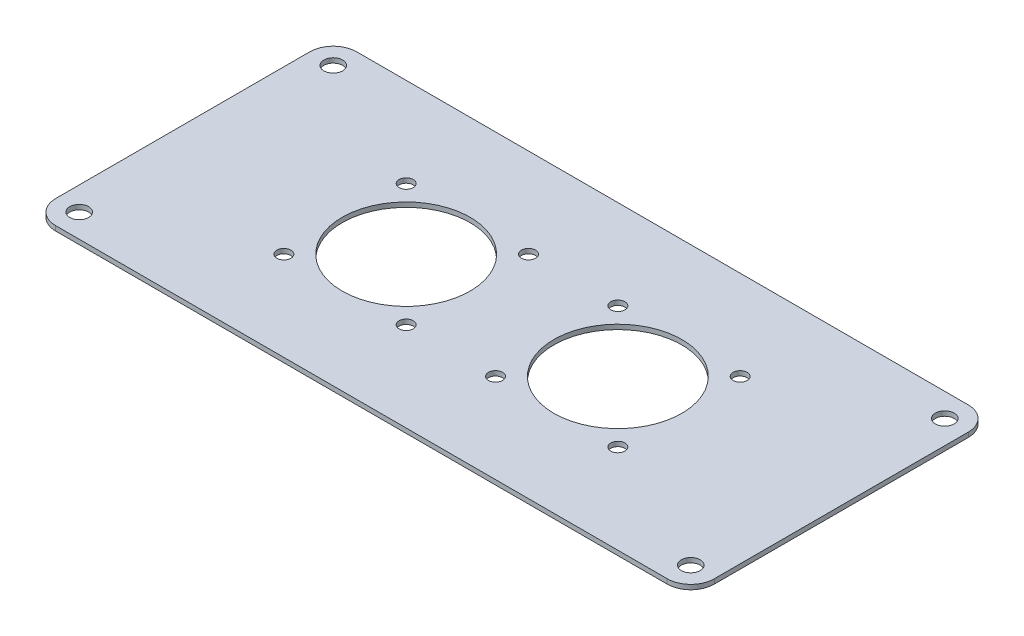
ISO-10303-21;
HEADER;
FILE_DESCRIPTION(('STEP AP214'),'2;1');
FILE_NAME('part.step','',(''),(''),'','','');
FILE_SCHEMA(('AUTOMOTIVE_DESIGN { 1 0 10303 214 1 1 1 1 }'));
ENDSEC;
DATA;
#1=APPLICATION_CONTEXT('core data for automotive mechanical design processes');
#2=APPLICATION_PROTOCOL_DEFINITION('international standard','automotive_design',2000,#1);
#3=PRODUCT_CONTEXT('',#1,'mechanical');
#4=PRODUCT('Part','Part','',(#3));
#5=PRODUCT_RELATED_PRODUCT_CATEGORY('part','',(#4));
#6=PRODUCT_DEFINITION_FORMATION('','',#4);
#7=PRODUCT_DEFINITION_CONTEXT('part definition',#1,'design');
#8=PRODUCT_DEFINITION('design','',#6,#7);
#9=PRODUCT_DEFINITION_SHAPE('','',#8);
#10=(LENGTH_UNIT() NAMED_UNIT(*) SI_UNIT(.MILLI.,.METRE.));
#11=(NAMED_UNIT(*) PLANE_ANGLE_UNIT() SI_UNIT($,.RADIAN.));
#12=(NAMED_UNIT(*) SI_UNIT($,.STERADIAN.) SOLID_ANGLE_UNIT());
#13=UNCERTAINTY_MEASURE_WITH_UNIT(LENGTH_MEASURE(1.E-05),#10,'distance_accuracy_value','');
#14=(GEOMETRIC_REPRESENTATION_CONTEXT(3) GLOBAL_UNCERTAINTY_ASSIGNED_CONTEXT((#13)) GLOBAL_UNIT_ASSIGNED_CONTEXT((#10,
#11,#12)) REPRESENTATION_CONTEXT('',''));
#15=CARTESIAN_POINT('',(0.,0.,0.));
#16=DIRECTION('',(0.,0.,1.));
#17=DIRECTION('',(1.,0.,0.));
#18=AXIS2_PLACEMENT_3D('',#15,#16,#17);
#19=CARTESIAN_POINT('',(-53.7713068872613,-1.,-34.1946356491883));
#20=DIRECTION('',(-1.,0.,0.));
#21=DIRECTION('',(0.,0.,1.));
#22=AXIS2_PLACEMENT_3D('',#19,#20,#21);
#23=PLANE('',#22);
#24=DIRECTION('',(0.,0.,1.));
#25=VECTOR('',#24,1.);
#26=CARTESIAN_POINT('',(-53.7713068872613,0.,-34.1946356491883));
#27=LINE('',#26,#25);
#28=CARTESIAN_POINT('',(-53.7713068872613,0.,-29.1946356491883));
#29=VERTEX_POINT('',#28);
#30=CARTESIAN_POINT('',(-53.7713068872613,0.,24.8053643508117));
#31=VERTEX_POINT('',#30);
#32=EDGE_CURVE('E155',#29,#31,#27,.T.);
#33=ORIENTED_EDGE('',*,*,#32,.F.);
#34=DIRECTION('',(0.,1.,0.));
#35=VECTOR('',#34,1.);
#36=CARTESIAN_POINT('',(-53.7713068872613,-1.,-29.1946356491883));
#37=LINE('',#36,#35);
#38=CARTESIAN_POINT('',(-53.7713068872613,-1.,-29.1946356491883));
#39=VERTEX_POINT('',#38);
#40=EDGE_CURVE('E11',#29,#39,#37,.F.);
#41=ORIENTED_EDGE('',*,*,#40,.T.);
#42=DIRECTION('',(0.,0.,1.));
#43=VECTOR('',#42,1.);
#44=CARTESIAN_POINT('',(-53.7713068872613,-1.,-34.1946356491883));
#45=LINE('',#44,#43);
#46=CARTESIAN_POINT('',(-53.7713068872613,-1.,24.8053643508117));
#47=VERTEX_POINT('',#46);
#48=EDGE_CURVE('E158',#39,#47,#45,.T.);
#49=ORIENTED_EDGE('',*,*,#48,.T.);
#50=DIRECTION('',(0.,1.,0.));
#51=VECTOR('',#50,1.);
#52=CARTESIAN_POINT('',(-53.7713068872613,-1.,24.8053643508117));
#53=LINE('',#52,#51);
#54=EDGE_CURVE('E43',#47,#31,#53,.T.);
#55=ORIENTED_EDGE('',*,*,#54,.T.);
#56=EDGE_LOOP('',(#33,#41,#49,#55));
#57=FACE_BOUND('',#56,.T.);
#58=ADVANCED_FACE('F35',(#57),#23,.T.);
#59=CARTESIAN_POINT('',(-53.7713068872613,-1.,-34.1946356491883));
#60=DIRECTION('',(0.,0.,-1.));
#61=DIRECTION('',(-1.,0.,0.));
#62=AXIS2_PLACEMENT_3D('',#59,#60,#61);
#63=PLANE('',#62);
#64=DIRECTION('',(-1.,0.,0.));
#65=VECTOR('',#64,1.);
#66=CARTESIAN_POINT('',(-53.7713068872613,0.,-34.1946356491883));
#67=LINE('',#66,#65);
#68=CARTESIAN_POINT('',(81.2286931127387,0.,-34.1946356491883));
#69=VERTEX_POINT('',#68);
#70=CARTESIAN_POINT('',(-48.7713068872613,0.,-34.1946356491883));
#71=VERTEX_POINT('',#70);
#72=EDGE_CURVE('E120',#69,#71,#67,.T.);
#73=ORIENTED_EDGE('',*,*,#72,.F.);
#74=DIRECTION('',(0.,1.,0.));
#75=VECTOR('',#74,1.);
#76=CARTESIAN_POINT('',(81.2286931127387,-1.,-34.1946356491883));
#77=LINE('',#76,#75);
#78=CARTESIAN_POINT('',(81.2286931127387,-1.,-34.1946356491883));
#79=VERTEX_POINT('',#78);
#80=EDGE_CURVE('E138',#69,#79,#77,.F.);
#81=ORIENTED_EDGE('',*,*,#80,.T.);
#82=DIRECTION('',(-1.,0.,0.));
#83=VECTOR('',#82,1.);
#84=CARTESIAN_POINT('',(-53.7713068872613,-1.,-34.1946356491883));
#85=LINE('',#84,#83);
#86=CARTESIAN_POINT('',(-48.7713068872613,-1.,-34.1946356491883));
#87=VERTEX_POINT('',#86);
#88=EDGE_CURVE('E123',#79,#87,#85,.T.);
#89=ORIENTED_EDGE('',*,*,#88,.T.);
#90=DIRECTION('',(0.,1.,0.));
#91=VECTOR('',#90,1.);
#92=CARTESIAN_POINT('',(-48.7713068872613,-1.,-34.1946356491883));
#93=LINE('',#92,#91);
#94=EDGE_CURVE('E135',#87,#71,#93,.T.);
#95=ORIENTED_EDGE('',*,*,#94,.T.);
#96=EDGE_LOOP('',(#73,#81,#89,#95));
#97=FACE_BOUND('',#96,.T.);
#98=ADVANCED_FACE('F307',(#97),#63,.T.);
#99=CARTESIAN_POINT('',(86.2286931127387,-1.,-34.1946356491883));
#100=DIRECTION('',(1.,0.,0.));
#101=DIRECTION('',(0.,0.,-1.));
#102=AXIS2_PLACEMENT_3D('',#99,#100,#101);
#103=PLANE('',#102);
#104=DIRECTION('',(0.,0.,-1.));
#105=VECTOR('',#104,1.);
#106=CARTESIAN_POINT('',(86.2286931127387,-1.,-34.1946356491883));
#107=LINE('',#106,#105);
#108=CARTESIAN_POINT('',(86.2286931127387,-1.,24.8053643508117));
#109=VERTEX_POINT('',#108);
#110=CARTESIAN_POINT('',(86.2286931127387,-1.,-29.1946356491883));
#111=VERTEX_POINT('',#110);
#112=EDGE_CURVE('E128',#109,#111,#107,.T.);
#113=ORIENTED_EDGE('',*,*,#112,.T.);
#114=DIRECTION('',(0.,1.,0.));
#115=VECTOR('',#114,1.);
#116=CARTESIAN_POINT('',(86.2286931127387,-1.,-29.1946356491883));
#117=LINE('',#116,#115);
#118=CARTESIAN_POINT('',(86.2286931127387,0.,-29.1946356491883));
#119=VERTEX_POINT('',#118);
#120=EDGE_CURVE('E119',#111,#119,#117,.T.);
#121=ORIENTED_EDGE('',*,*,#120,.T.);
#122=DIRECTION('',(0.,0.,-1.));
#123=VECTOR('',#122,1.);
#124=CARTESIAN_POINT('',(86.2286931127387,0.,-34.1946356491883));
#125=LINE('',#124,#123);
#126=CARTESIAN_POINT('',(86.2286931127387,0.,24.8053643508117));
#127=VERTEX_POINT('',#126);
#128=EDGE_CURVE('E104',#127,#119,#125,.T.);
#129=ORIENTED_EDGE('',*,*,#128,.F.);
#130=DIRECTION('',(0.,1.,0.));
#131=VECTOR('',#130,1.);
#132=CARTESIAN_POINT('',(86.2286931127387,-1.,24.8053643508117));
#133=LINE('',#132,#131);
#134=EDGE_CURVE('E117',#127,#109,#133,.F.);
#135=ORIENTED_EDGE('',*,*,#134,.T.);
#136=EDGE_LOOP('',(#113,#121,#129,#135));
#137=FACE_BOUND('',#136,.T.);
#138=ADVANCED_FACE('F116',(#137),#103,.T.);
#139=CARTESIAN_POINT('',(-53.7713068872613,-1.,29.8053643508117));
#140=DIRECTION('',(0.,0.,1.));
#141=DIRECTION('',(1.,0.,0.));
#142=AXIS2_PLACEMENT_3D('',#139,#140,#141);
#143=PLANE('',#142);
#144=DIRECTION('',(1.,0.,0.));
#145=VECTOR('',#144,1.);
#146=CARTESIAN_POINT('',(-53.7713068872613,-1.,29.8053643508117));
#147=LINE('',#146,#145);
#148=CARTESIAN_POINT('',(-48.7713068872613,-1.,29.8053643508117));
#149=VERTEX_POINT('',#148);
#150=CARTESIAN_POINT('',(81.2286931127387,-1.,29.8053643508117));
#151=VERTEX_POINT('',#150);
#152=EDGE_CURVE('E170',#149,#151,#147,.T.);
#153=ORIENTED_EDGE('',*,*,#152,.T.);
#154=DIRECTION('',(0.,1.,0.));
#155=VECTOR('',#154,1.);
#156=CARTESIAN_POINT('',(81.2286931127387,-1.,29.8053643508117));
#157=LINE('',#156,#155);
#158=CARTESIAN_POINT('',(81.2286931127387,0.,29.8053643508117));
#159=VERTEX_POINT('',#158);
#160=EDGE_CURVE('E148',#151,#159,#157,.T.);
#161=ORIENTED_EDGE('',*,*,#160,.T.);
#162=DIRECTION('',(1.,0.,0.));
#163=VECTOR('',#162,1.);
#164=CARTESIAN_POINT('',(-53.7713068872613,0.,29.8053643508117));
#165=LINE('',#164,#163);
#166=CARTESIAN_POINT('',(-48.7713068872613,0.,29.8053643508117));
#167=VERTEX_POINT('',#166);
#168=EDGE_CURVE('E105',#167,#159,#165,.T.);
#169=ORIENTED_EDGE('',*,*,#168,.F.);
#170=DIRECTION('',(0.,1.,0.));
#171=VECTOR('',#170,1.);
#172=CARTESIAN_POINT('',(-48.7713068872613,-1.,29.8053643508117));
#173=LINE('',#172,#171);
#174=EDGE_CURVE('E57',#167,#149,#173,.F.);
#175=ORIENTED_EDGE('',*,*,#174,.T.);
#176=EDGE_LOOP('',(#153,#161,#169,#175));
#177=FACE_BOUND('',#176,.T.);
#178=ADVANCED_FACE('F296',(#177),#143,.T.);
#179=CARTESIAN_POINT('',(-53.7713068872613,-1.,29.8053643508117));
#180=DIRECTION('',(0.,1.,0.));
#181=DIRECTION('',(0.,0.,1.));
#182=AXIS2_PLACEMENT_3D('',#179,#180,#181);
#183=PLANE('',#182);
#184=CARTESIAN_POINT('',(51.7286931127387,-0.999999999999999,10.8053643508117));
#185=DIRECTION('',(0.,1.,0.));
#186=DIRECTION('',(0.,0.,1.));
#187=AXIS2_PLACEMENT_3D('',#184,#185,#186);
#188=CIRCLE('',#187,1.5);
#189=CARTESIAN_POINT('',(51.7286931127387,-0.999999999999999,12.3053643508117));
#190=VERTEX_POINT('',#189);
#191=EDGE_CURVE('E247',#190,#190,#188,.T.);
#192=ORIENTED_EDGE('',*,*,#191,.T.);
#193=EDGE_LOOP('',(#192));
#194=FACE_BOUND('',#193,.T.);
#195=CARTESIAN_POINT('',(25.7286931127387,-0.999999999999999,10.8053643508117));
#196=DIRECTION('',(0.,1.,0.));
#197=DIRECTION('',(0.,0.,1.));
#198=AXIS2_PLACEMENT_3D('',#195,#196,#197);
#199=CIRCLE('',#198,1.5);
#200=CARTESIAN_POINT('',(25.7286931127387,-0.999999999999999,12.3053643508117));
#201=VERTEX_POINT('',#200);
#202=EDGE_CURVE('E241',#201,#201,#199,.T.);
#203=ORIENTED_EDGE('',*,*,#202,.T.);
#204=EDGE_LOOP('',(#203));
#205=FACE_BOUND('',#204,.T.);
#206=CARTESIAN_POINT('',(51.7286931127387,-0.999999999999999,-15.1946356491883));
#207=DIRECTION('',(0.,1.,0.));
#208=DIRECTION('',(0.,0.,1.));
#209=AXIS2_PLACEMENT_3D('',#206,#207,#208);
#210=CIRCLE('',#209,1.5);
#211=CARTESIAN_POINT('',(51.7286931127387,-0.999999999999999,-13.6946356491883));
#212=VERTEX_POINT('',#211);
#213=EDGE_CURVE('E235',#212,#212,#210,.T.);
#214=ORIENTED_EDGE('',*,*,#213,.T.);
#215=EDGE_LOOP('',(#214));
#216=FACE_BOUND('',#215,.T.);
#217=CARTESIAN_POINT('',(25.7286931127387,-0.999999999999999,-15.1946356491883));
#218=DIRECTION('',(0.,1.,0.));
#219=DIRECTION('',(0.,0.,1.));
#220=AXIS2_PLACEMENT_3D('',#217,#218,#219);
#221=CIRCLE('',#220,1.5);
#222=CARTESIAN_POINT('',(25.7286931127387,-0.999999999999999,-13.6946356491883));
#223=VERTEX_POINT('',#222);
#224=EDGE_CURVE('E229',#223,#223,#221,.T.);
#225=ORIENTED_EDGE('',*,*,#224,.T.);
#226=EDGE_LOOP('',(#225));
#227=FACE_BOUND('',#226,.T.);
#228=CARTESIAN_POINT('',(6.72869311273867,-0.999999999999999,10.8053643508117));
#229=DIRECTION('',(0.,1.,0.));
#230=DIRECTION('',(0.,0.,1.));
#231=AXIS2_PLACEMENT_3D('',#228,#229,#230);
#232=CIRCLE('',#231,1.5);
#233=CARTESIAN_POINT('',(6.72869311273867,-0.999999999999999,12.3053643508117));
#234=VERTEX_POINT('',#233);
#235=EDGE_CURVE('E223',#234,#234,#232,.T.);
#236=ORIENTED_EDGE('',*,*,#235,.T.);
#237=EDGE_LOOP('',(#236));
#238=FACE_BOUND('',#237,.T.);
#239=CARTESIAN_POINT('',(-19.2713068872613,-0.999999999999999,10.8053643508117));
#240=DIRECTION('',(0.,1.,0.));
#241=DIRECTION('',(0.,0.,1.));
#242=AXIS2_PLACEMENT_3D('',#239,#240,#241);
#243=CIRCLE('',#242,1.5);
#244=CARTESIAN_POINT('',(-19.2713068872613,-0.999999999999999,12.3053643508117));
#245=VERTEX_POINT('',#244);
#246=EDGE_CURVE('E217',#245,#245,#243,.T.);
#247=ORIENTED_EDGE('',*,*,#246,.T.);
#248=EDGE_LOOP('',(#247));
#249=FACE_BOUND('',#248,.T.);
#250=CARTESIAN_POINT('',(6.72869311273866,-0.999999999999999,-15.1946356491883));
#251=DIRECTION('',(0.,1.,0.));
#252=DIRECTION('',(0.,0.,1.));
#253=AXIS2_PLACEMENT_3D('',#250,#251,#252);
#254=CIRCLE('',#253,1.5);
#255=CARTESIAN_POINT('',(6.72869311273866,-0.999999999999999,-13.6946356491883));
#256=VERTEX_POINT('',#255);
#257=EDGE_CURVE('E211',#256,#256,#254,.T.);
#258=ORIENTED_EDGE('',*,*,#257,.T.);
#259=EDGE_LOOP('',(#258));
#260=FACE_BOUND('',#259,.T.);
#261=CARTESIAN_POINT('',(-19.2713068872613,-0.999999999999999,-15.1946356491883));
#262=DIRECTION('',(0.,1.,0.));
#263=DIRECTION('',(0.,0.,1.));
#264=AXIS2_PLACEMENT_3D('',#261,#262,#263);
#265=CIRCLE('',#264,1.5);
#266=CARTESIAN_POINT('',(-19.2713068872613,-0.999999999999999,-13.6946356491883));
#267=VERTEX_POINT('',#266);
#268=EDGE_CURVE('E205',#267,#267,#265,.T.);
#269=ORIENTED_EDGE('',*,*,#268,.T.);
#270=EDGE_LOOP('',(#269));
#271=FACE_BOUND('',#270,.T.);
#272=CARTESIAN_POINT('',(38.7286931127387,-0.999999999999999,-2.19463564918833));
#273=DIRECTION('',(0.,1.,0.));
#274=DIRECTION('',(0.,0.,1.));
#275=AXIS2_PLACEMENT_3D('',#272,#273,#274);
#276=CIRCLE('',#275,13.6);
#277=CARTESIAN_POINT('',(38.7286931127387,-0.999999999999999,11.4053643508117));
#278=VERTEX_POINT('',#277);
#279=EDGE_CURVE('E199',#278,#278,#276,.T.);
#280=ORIENTED_EDGE('',*,*,#279,.T.);
#281=EDGE_LOOP('',(#280));
#282=FACE_BOUND('',#281,.T.);
#283=CARTESIAN_POINT('',(-6.27130688726133,-0.999999999999999,-2.19463564918833));
#284=DIRECTION('',(0.,1.,0.));
#285=DIRECTION('',(0.,0.,1.));
#286=AXIS2_PLACEMENT_3D('',#283,#284,#285);
#287=CIRCLE('',#286,13.6);
#288=CARTESIAN_POINT('',(-6.27130688726133,-0.999999999999999,11.4053643508117));
#289=VERTEX_POINT('',#288);
#290=EDGE_CURVE('E193',#289,#289,#287,.T.);
#291=ORIENTED_EDGE('',*,*,#290,.T.);
#292=EDGE_LOOP('',(#291));
#293=FACE_BOUND('',#292,.T.);
#294=CARTESIAN_POINT('',(81.2286931127387,-0.999999999999999,24.8053643508117));
#295=DIRECTION('',(0.,1.,0.));
#296=DIRECTION('',(0.,0.,1.));
#297=AXIS2_PLACEMENT_3D('',#294,#295,#296);
#298=CIRCLE('',#297,2.);
#299=CARTESIAN_POINT('',(81.2286931127387,-0.999999999999999,26.8053643508117));
#300=VERTEX_POINT('',#299);
#301=EDGE_CURVE('E187',#300,#300,#298,.T.);
#302=ORIENTED_EDGE('',*,*,#301,.T.);
#303=EDGE_LOOP('',(#302));
#304=FACE_BOUND('',#303,.T.);
#305=CARTESIAN_POINT('',(-48.7713068872613,-0.999999999999999,24.8053643508117));
#306=DIRECTION('',(0.,1.,0.));
#307=DIRECTION('',(0.,0.,1.));
#308=AXIS2_PLACEMENT_3D('',#305,#306,#307);
#309=CIRCLE('',#308,2.);
#310=CARTESIAN_POINT('',(-48.7713068872613,-0.999999999999999,26.8053643508117));
#311=VERTEX_POINT('',#310);
#312=EDGE_CURVE('E181',#311,#311,#309,.T.);
#313=ORIENTED_EDGE('',*,*,#312,.T.);
#314=EDGE_LOOP('',(#313));
#315=FACE_BOUND('',#314,.T.);
#316=CARTESIAN_POINT('',(81.2286931127387,-0.999999999999999,-29.1946356491883));
#317=DIRECTION('',(0.,1.,0.));
#318=DIRECTION('',(0.,0.,1.));
#319=AXIS2_PLACEMENT_3D('',#316,#317,#318);
#320=CIRCLE('',#319,2.);
#321=CARTESIAN_POINT('',(81.2286931127387,-0.999999999999999,-27.1946356491883));
#322=VERTEX_POINT('',#321);
#323=EDGE_CURVE('E175',#322,#322,#320,.T.);
#324=ORIENTED_EDGE('',*,*,#323,.T.);
#325=EDGE_LOOP('',(#324));
#326=FACE_BOUND('',#325,.T.);
#327=CARTESIAN_POINT('',(-48.7713068872613,-0.999999999999999,-29.1946356491883));
#328=DIRECTION('',(0.,1.,0.));
#329=DIRECTION('',(0.,0.,1.));
#330=AXIS2_PLACEMENT_3D('',#327,#328,#329);
#331=CIRCLE('',#330,2.);
#332=CARTESIAN_POINT('',(-48.7713068872613,-0.999999999999999,-27.1946356491883));
#333=VERTEX_POINT('',#332);
#334=EDGE_CURVE('E162',#333,#333,#331,.T.);
#335=ORIENTED_EDGE('',*,*,#334,.T.);
#336=EDGE_LOOP('',(#335));
#337=FACE_BOUND('',#336,.T.);
#338=ORIENTED_EDGE('',*,*,#88,.F.);
#339=CARTESIAN_POINT('',(81.2286931127387,-1.,-29.1946356491883));
#340=DIRECTION('',(0.,1.,0.));
#341=DIRECTION('',(0.,0.,1.));
#342=AXIS2_PLACEMENT_3D('',#339,#340,#341);
#343=CIRCLE('',#342,5.);
#344=EDGE_CURVE('E145',#79,#111,#343,.F.);
#345=ORIENTED_EDGE('',*,*,#344,.T.);
#346=ORIENTED_EDGE('',*,*,#112,.F.);
#347=CARTESIAN_POINT('',(81.2286931127387,-1.,24.8053643508117));
#348=DIRECTION('',(0.,1.,0.));
#349=DIRECTION('',(0.,0.,1.));
#350=AXIS2_PLACEMENT_3D('',#347,#348,#349);
#351=CIRCLE('',#350,5.);
#352=EDGE_CURVE('E50',#109,#151,#351,.F.);
#353=ORIENTED_EDGE('',*,*,#352,.T.);
#354=ORIENTED_EDGE('',*,*,#152,.F.);
#355=CARTESIAN_POINT('',(-48.7713068872613,-1.,24.8053643508117));
#356=DIRECTION('',(0.,1.,0.));
#357=DIRECTION('',(0.,0.,1.));
#358=AXIS2_PLACEMENT_3D('',#355,#356,#357);
#359=CIRCLE('',#358,5.);
#360=EDGE_CURVE('E140',#149,#47,#359,.F.);
#361=ORIENTED_EDGE('',*,*,#360,.T.);
#362=ORIENTED_EDGE('',*,*,#48,.F.);
#363=CARTESIAN_POINT('',(-48.7713068872613,-1.,-29.1946356491883));
#364=DIRECTION('',(0.,1.,0.));
#365=DIRECTION('',(0.,0.,1.));
#366=AXIS2_PLACEMENT_3D('',#363,#364,#365);
#367=CIRCLE('',#366,5.);
#368=EDGE_CURVE('E142',#39,#87,#367,.F.);
#369=ORIENTED_EDGE('',*,*,#368,.T.);
#370=EDGE_LOOP('',(#338,#345,#346,#353,#354,#361,#362,#369));
#371=FACE_BOUND('',#370,.T.);
#372=ADVANCED_FACE('F260',(#194,#205,#216,#227,#238,#249,#260,#271,#282,#293,#304,#315,#326,
#337,#371),#183,.F.);
#373=CARTESIAN_POINT('',(-53.7713068872613,0.,29.8053643508117));
#374=DIRECTION('',(0.,1.,0.));
#375=DIRECTION('',(0.,0.,1.));
#376=AXIS2_PLACEMENT_3D('',#373,#374,#375);
#377=PLANE('',#376);
#378=CARTESIAN_POINT('',(51.7286931127387,0.,10.8053643508117));
#379=DIRECTION('',(0.,1.,0.));
#380=DIRECTION('',(0.,0.,1.));
#381=AXIS2_PLACEMENT_3D('',#378,#379,#380);
#382=CIRCLE('',#381,1.5);
#383=CARTESIAN_POINT('',(51.7286931127387,0.,12.3053643508117));
#384=VERTEX_POINT('',#383);
#385=EDGE_CURVE('E250',#384,#384,#382,.T.);
#386=ORIENTED_EDGE('',*,*,#385,.F.);
#387=EDGE_LOOP('',(#386));
#388=FACE_BOUND('',#387,.T.);
#389=CARTESIAN_POINT('',(25.7286931127387,0.,10.8053643508117));
#390=DIRECTION('',(0.,1.,0.));
#391=DIRECTION('',(0.,0.,1.));
#392=AXIS2_PLACEMENT_3D('',#389,#390,#391);
#393=CIRCLE('',#392,1.5);
#394=CARTESIAN_POINT('',(25.7286931127387,0.,12.3053643508117));
#395=VERTEX_POINT('',#394);
#396=EDGE_CURVE('E244',#395,#395,#393,.T.);
#397=ORIENTED_EDGE('',*,*,#396,.F.);
#398=EDGE_LOOP('',(#397));
#399=FACE_BOUND('',#398,.T.);
#400=CARTESIAN_POINT('',(51.7286931127387,0.,-15.1946356491883));
#401=DIRECTION('',(0.,1.,0.));
#402=DIRECTION('',(0.,0.,1.));
#403=AXIS2_PLACEMENT_3D('',#400,#401,#402);
#404=CIRCLE('',#403,1.5);
#405=CARTESIAN_POINT('',(51.7286931127387,0.,-13.6946356491883));
#406=VERTEX_POINT('',#405);
#407=EDGE_CURVE('E238',#406,#406,#404,.T.);
#408=ORIENTED_EDGE('',*,*,#407,.F.);
#409=EDGE_LOOP('',(#408));
#410=FACE_BOUND('',#409,.T.);
#411=CARTESIAN_POINT('',(25.7286931127387,0.,-15.1946356491883));
#412=DIRECTION('',(0.,1.,0.));
#413=DIRECTION('',(0.,0.,1.));
#414=AXIS2_PLACEMENT_3D('',#411,#412,#413);
#415=CIRCLE('',#414,1.5);
#416=CARTESIAN_POINT('',(25.7286931127387,0.,-13.6946356491883));
#417=VERTEX_POINT('',#416);
#418=EDGE_CURVE('E232',#417,#417,#415,.T.);
#419=ORIENTED_EDGE('',*,*,#418,.F.);
#420=EDGE_LOOP('',(#419));
#421=FACE_BOUND('',#420,.T.);
#422=CARTESIAN_POINT('',(6.72869311273867,0.,10.8053643508117));
#423=DIRECTION('',(0.,1.,0.));
#424=DIRECTION('',(0.,0.,1.));
#425=AXIS2_PLACEMENT_3D('',#422,#423,#424);
#426=CIRCLE('',#425,1.5);
#427=CARTESIAN_POINT('',(6.72869311273867,0.,12.3053643508117));
#428=VERTEX_POINT('',#427);
#429=EDGE_CURVE('E226',#428,#428,#426,.T.);
#430=ORIENTED_EDGE('',*,*,#429,.F.);
#431=EDGE_LOOP('',(#430));
#432=FACE_BOUND('',#431,.T.);
#433=CARTESIAN_POINT('',(-19.2713068872613,0.,10.8053643508117));
#434=DIRECTION('',(0.,1.,0.));
#435=DIRECTION('',(0.,0.,1.));
#436=AXIS2_PLACEMENT_3D('',#433,#434,#435);
#437=CIRCLE('',#436,1.5);
#438=CARTESIAN_POINT('',(-19.2713068872613,0.,12.3053643508117));
#439=VERTEX_POINT('',#438);
#440=EDGE_CURVE('E220',#439,#439,#437,.T.);
#441=ORIENTED_EDGE('',*,*,#440,.F.);
#442=EDGE_LOOP('',(#441));
#443=FACE_BOUND('',#442,.T.);
#444=CARTESIAN_POINT('',(6.72869311273866,0.,-15.1946356491883));
#445=DIRECTION('',(0.,1.,0.));
#446=DIRECTION('',(0.,0.,1.));
#447=AXIS2_PLACEMENT_3D('',#444,#445,#446);
#448=CIRCLE('',#447,1.5);
#449=CARTESIAN_POINT('',(6.72869311273866,0.,-13.6946356491883));
#450=VERTEX_POINT('',#449);
#451=EDGE_CURVE('E214',#450,#450,#448,.T.);
#452=ORIENTED_EDGE('',*,*,#451,.F.);
#453=EDGE_LOOP('',(#452));
#454=FACE_BOUND('',#453,.T.);
#455=CARTESIAN_POINT('',(-19.2713068872613,0.,-15.1946356491883));
#456=DIRECTION('',(0.,1.,0.));
#457=DIRECTION('',(0.,0.,1.));
#458=AXIS2_PLACEMENT_3D('',#455,#456,#457);
#459=CIRCLE('',#458,1.5);
#460=CARTESIAN_POINT('',(-19.2713068872613,0.,-13.6946356491883));
#461=VERTEX_POINT('',#460);
#462=EDGE_CURVE('E208',#461,#461,#459,.T.);
#463=ORIENTED_EDGE('',*,*,#462,.F.);
#464=EDGE_LOOP('',(#463));
#465=FACE_BOUND('',#464,.T.);
#466=CARTESIAN_POINT('',(38.7286931127387,0.,-2.19463564918833));
#467=DIRECTION('',(0.,1.,0.));
#468=DIRECTION('',(0.,0.,1.));
#469=AXIS2_PLACEMENT_3D('',#466,#467,#468);
#470=CIRCLE('',#469,13.6);
#471=CARTESIAN_POINT('',(38.7286931127387,0.,11.4053643508117));
#472=VERTEX_POINT('',#471);
#473=EDGE_CURVE('E202',#472,#472,#470,.T.);
#474=ORIENTED_EDGE('',*,*,#473,.F.);
#475=EDGE_LOOP('',(#474));
#476=FACE_BOUND('',#475,.T.);
#477=CARTESIAN_POINT('',(-6.27130688726133,0.,-2.19463564918833));
#478=DIRECTION('',(0.,1.,0.));
#479=DIRECTION('',(0.,0.,1.));
#480=AXIS2_PLACEMENT_3D('',#477,#478,#479);
#481=CIRCLE('',#480,13.6);
#482=CARTESIAN_POINT('',(-6.27130688726133,0.,11.4053643508117));
#483=VERTEX_POINT('',#482);
#484=EDGE_CURVE('E196',#483,#483,#481,.T.);
#485=ORIENTED_EDGE('',*,*,#484,.F.);
#486=EDGE_LOOP('',(#485));
#487=FACE_BOUND('',#486,.T.);
#488=CARTESIAN_POINT('',(81.2286931127387,0.,24.8053643508117));
#489=DIRECTION('',(0.,1.,0.));
#490=DIRECTION('',(0.,0.,1.));
#491=AXIS2_PLACEMENT_3D('',#488,#489,#490);
#492=CIRCLE('',#491,2.);
#493=CARTESIAN_POINT('',(81.2286931127387,0.,26.8053643508117));
#494=VERTEX_POINT('',#493);
#495=EDGE_CURVE('E190',#494,#494,#492,.T.);
#496=ORIENTED_EDGE('',*,*,#495,.F.);
#497=EDGE_LOOP('',(#496));
#498=FACE_BOUND('',#497,.T.);
#499=CARTESIAN_POINT('',(-48.7713068872613,0.,24.8053643508117));
#500=DIRECTION('',(0.,1.,0.));
#501=DIRECTION('',(0.,0.,1.));
#502=AXIS2_PLACEMENT_3D('',#499,#500,#501);
#503=CIRCLE('',#502,2.);
#504=CARTESIAN_POINT('',(-48.7713068872613,0.,26.8053643508117));
#505=VERTEX_POINT('',#504);
#506=EDGE_CURVE('E184',#505,#505,#503,.T.);
#507=ORIENTED_EDGE('',*,*,#506,.F.);
#508=EDGE_LOOP('',(#507));
#509=FACE_BOUND('',#508,.T.);
#510=CARTESIAN_POINT('',(81.2286931127387,0.,-29.1946356491883));
#511=DIRECTION('',(0.,1.,0.));
#512=DIRECTION('',(0.,0.,1.));
#513=AXIS2_PLACEMENT_3D('',#510,#511,#512);
#514=CIRCLE('',#513,2.);
#515=CARTESIAN_POINT('',(81.2286931127387,0.,-27.1946356491883));
#516=VERTEX_POINT('',#515);
#517=EDGE_CURVE('E178',#516,#516,#514,.T.);
#518=ORIENTED_EDGE('',*,*,#517,.F.);
#519=EDGE_LOOP('',(#518));
#520=FACE_BOUND('',#519,.T.);
#521=CARTESIAN_POINT('',(-48.7713068872613,0.,-29.1946356491883));
#522=DIRECTION('',(0.,1.,0.));
#523=DIRECTION('',(0.,0.,1.));
#524=AXIS2_PLACEMENT_3D('',#521,#522,#523);
#525=CIRCLE('',#524,2.);
#526=CARTESIAN_POINT('',(-48.7713068872613,0.,-27.1946356491883));
#527=VERTEX_POINT('',#526);
#528=EDGE_CURVE('E166',#527,#527,#525,.T.);
#529=ORIENTED_EDGE('',*,*,#528,.F.);
#530=EDGE_LOOP('',(#529));
#531=FACE_BOUND('',#530,.T.);
#532=ORIENTED_EDGE('',*,*,#128,.T.);
#533=CARTESIAN_POINT('',(81.2286931127387,0.,-29.1946356491883));
#534=DIRECTION('',(0.,1.,0.));
#535=DIRECTION('',(0.,0.,1.));
#536=AXIS2_PLACEMENT_3D('',#533,#534,#535);
#537=CIRCLE('',#536,5.);
#538=EDGE_CURVE('E110',#119,#69,#537,.T.);
#539=ORIENTED_EDGE('',*,*,#538,.T.);
#540=ORIENTED_EDGE('',*,*,#72,.T.);
#541=CARTESIAN_POINT('',(-48.7713068872613,0.,-29.1946356491883));
#542=DIRECTION('',(0.,1.,0.));
#543=DIRECTION('',(0.,0.,1.));
#544=AXIS2_PLACEMENT_3D('',#541,#542,#543);
#545=CIRCLE('',#544,5.);
#546=EDGE_CURVE('E111',#71,#29,#545,.T.);
#547=ORIENTED_EDGE('',*,*,#546,.T.);
#548=ORIENTED_EDGE('',*,*,#32,.T.);
#549=CARTESIAN_POINT('',(-48.7713068872613,0.,24.8053643508117));
#550=DIRECTION('',(0.,1.,0.));
#551=DIRECTION('',(0.,0.,1.));
#552=AXIS2_PLACEMENT_3D('',#549,#550,#551);
#553=CIRCLE('',#552,5.);
#554=EDGE_CURVE('E125',#31,#167,#553,.T.);
#555=ORIENTED_EDGE('',*,*,#554,.T.);
#556=ORIENTED_EDGE('',*,*,#168,.T.);
#557=CARTESIAN_POINT('',(81.2286931127387,0.,24.8053643508117));
#558=DIRECTION('',(0.,1.,0.));
#559=DIRECTION('',(0.,0.,1.));
#560=AXIS2_PLACEMENT_3D('',#557,#558,#559);
#561=CIRCLE('',#560,5.);
#562=EDGE_CURVE('E101',#159,#127,#561,.T.);
#563=ORIENTED_EDGE('',*,*,#562,.T.);
#564=EDGE_LOOP('',(#532,#539,#540,#547,#548,#555,#556,#563));
#565=FACE_BOUND('',#564,.T.);
#566=ADVANCED_FACE('F103',(#388,#399,#410,#421,#432,#443,#454,#465,#476,#487,#498,#509,#520,
#531,#565),#377,.T.);
#567=CARTESIAN_POINT('',(81.2286931127387,-1.,-29.1946356491883));
#568=DIRECTION('',(0.,1.,0.));
#569=DIRECTION('',(0.,0.,1.));
#570=AXIS2_PLACEMENT_3D('',#567,#568,#569);
#571=CYLINDRICAL_SURFACE('',#570,5.);
#572=ORIENTED_EDGE('',*,*,#344,.F.);
#573=ORIENTED_EDGE('',*,*,#80,.F.);
#574=ORIENTED_EDGE('',*,*,#538,.F.);
#575=ORIENTED_EDGE('',*,*,#120,.F.);
#576=EDGE_LOOP('',(#572,#573,#574,#575));
#577=FACE_BOUND('',#576,.T.);
#578=ADVANCED_FACE('F259',(#577),#571,.T.);
#579=CARTESIAN_POINT('',(81.2286931127387,-1.,24.8053643508117));
#580=DIRECTION('',(0.,1.,0.));
#581=DIRECTION('',(0.,0.,1.));
#582=AXIS2_PLACEMENT_3D('',#579,#580,#581);
#583=CYLINDRICAL_SURFACE('',#582,5.);
#584=ORIENTED_EDGE('',*,*,#352,.F.);
#585=ORIENTED_EDGE('',*,*,#134,.F.);
#586=ORIENTED_EDGE('',*,*,#562,.F.);
#587=ORIENTED_EDGE('',*,*,#160,.F.);
#588=EDGE_LOOP('',(#584,#585,#586,#587));
#589=FACE_BOUND('',#588,.T.);
#590=ADVANCED_FACE('F122',(#589),#583,.T.);
#591=CARTESIAN_POINT('',(-48.7713068872613,-1.,-29.1946356491883));
#592=DIRECTION('',(0.,1.,0.));
#593=DIRECTION('',(0.,0.,1.));
#594=AXIS2_PLACEMENT_3D('',#591,#592,#593);
#595=CYLINDRICAL_SURFACE('',#594,5.);
#596=ORIENTED_EDGE('',*,*,#368,.F.);
#597=ORIENTED_EDGE('',*,*,#40,.F.);
#598=ORIENTED_EDGE('',*,*,#546,.F.);
#599=ORIENTED_EDGE('',*,*,#94,.F.);
#600=EDGE_LOOP('',(#596,#597,#598,#599));
#601=FACE_BOUND('',#600,.T.);
#602=ADVANCED_FACE('F309',(#601),#595,.T.);
#603=CARTESIAN_POINT('',(-48.7713068872613,-1.,24.8053643508117));
#604=DIRECTION('',(0.,1.,0.));
#605=DIRECTION('',(0.,0.,1.));
#606=AXIS2_PLACEMENT_3D('',#603,#604,#605);
#607=CYLINDRICAL_SURFACE('',#606,5.);
#608=ORIENTED_EDGE('',*,*,#360,.F.);
#609=ORIENTED_EDGE('',*,*,#174,.F.);
#610=ORIENTED_EDGE('',*,*,#554,.F.);
#611=ORIENTED_EDGE('',*,*,#54,.F.);
#612=EDGE_LOOP('',(#608,#609,#610,#611));
#613=FACE_BOUND('',#612,.T.);
#614=ADVANCED_FACE('F37',(#613),#607,.T.);
#615=CARTESIAN_POINT('',(-48.7713068872613,-10.,-29.1946356491883));
#616=DIRECTION('',(0.,1.,0.));
#617=DIRECTION('',(0.,0.,1.));
#618=AXIS2_PLACEMENT_3D('',#615,#616,#617);
#619=CYLINDRICAL_SURFACE('',#618,2.);
#620=ORIENTED_EDGE('',*,*,#528,.T.);
#621=EDGE_LOOP('',(#620));
#622=FACE_BOUND('',#621,.T.);
#623=ORIENTED_EDGE('',*,*,#334,.F.);
#624=EDGE_LOOP('',(#623));
#625=FACE_BOUND('',#624,.T.);
#626=ADVANCED_FACE('F288',(#622,#625),#619,.F.);
#627=CARTESIAN_POINT('',(81.2286931127387,-10.,-29.1946356491883));
#628=DIRECTION('',(0.,1.,0.));
#629=DIRECTION('',(0.,0.,1.));
#630=AXIS2_PLACEMENT_3D('',#627,#628,#629);
#631=CYLINDRICAL_SURFACE('',#630,2.);
#632=ORIENTED_EDGE('',*,*,#517,.T.);
#633=EDGE_LOOP('',(#632));
#634=FACE_BOUND('',#633,.T.);
#635=ORIENTED_EDGE('',*,*,#323,.F.);
#636=EDGE_LOOP('',(#635));
#637=FACE_BOUND('',#636,.T.);
#638=ADVANCED_FACE('F291',(#634,#637),#631,.F.);
#639=CARTESIAN_POINT('',(-48.7713068872613,-10.,24.8053643508117));
#640=DIRECTION('',(0.,1.,0.));
#641=DIRECTION('',(0.,0.,1.));
#642=AXIS2_PLACEMENT_3D('',#639,#640,#641);
#643=CYLINDRICAL_SURFACE('',#642,2.);
#644=ORIENTED_EDGE('',*,*,#506,.T.);
#645=EDGE_LOOP('',(#644));
#646=FACE_BOUND('',#645,.T.);
#647=ORIENTED_EDGE('',*,*,#312,.F.);
#648=EDGE_LOOP('',(#647));
#649=FACE_BOUND('',#648,.T.);
#650=ADVANCED_FACE('F353',(#646,#649),#643,.F.);
#651=CARTESIAN_POINT('',(81.2286931127387,-10.,24.8053643508117));
#652=DIRECTION('',(0.,1.,0.));
#653=DIRECTION('',(0.,0.,1.));
#654=AXIS2_PLACEMENT_3D('',#651,#652,#653);
#655=CYLINDRICAL_SURFACE('',#654,2.);
#656=ORIENTED_EDGE('',*,*,#495,.T.);
#657=EDGE_LOOP('',(#656));
#658=FACE_BOUND('',#657,.T.);
#659=ORIENTED_EDGE('',*,*,#301,.F.);
#660=EDGE_LOOP('',(#659));
#661=FACE_BOUND('',#660,.T.);
#662=ADVANCED_FACE('F363',(#658,#661),#655,.F.);
#663=CARTESIAN_POINT('',(-6.27130688726133,-10.,-2.19463564918833));
#664=DIRECTION('',(0.,1.,0.));
#665=DIRECTION('',(0.,0.,1.));
#666=AXIS2_PLACEMENT_3D('',#663,#664,#665);
#667=CYLINDRICAL_SURFACE('',#666,13.6);
#668=ORIENTED_EDGE('',*,*,#484,.T.);
#669=EDGE_LOOP('',(#668));
#670=FACE_BOUND('',#669,.T.);
#671=ORIENTED_EDGE('',*,*,#290,.F.);
#672=EDGE_LOOP('',(#671));
#673=FACE_BOUND('',#672,.T.);
#674=ADVANCED_FACE('F373',(#670,#673),#667,.F.);
#675=CARTESIAN_POINT('',(38.7286931127387,-10.,-2.19463564918833));
#676=DIRECTION('',(0.,1.,0.));
#677=DIRECTION('',(0.,0.,1.));
#678=AXIS2_PLACEMENT_3D('',#675,#676,#677);
#679=CYLINDRICAL_SURFACE('',#678,13.6);
#680=ORIENTED_EDGE('',*,*,#473,.T.);
#681=EDGE_LOOP('',(#680));
#682=FACE_BOUND('',#681,.T.);
#683=ORIENTED_EDGE('',*,*,#279,.F.);
#684=EDGE_LOOP('',(#683));
#685=FACE_BOUND('',#684,.T.);
#686=ADVANCED_FACE('F400',(#682,#685),#679,.F.);
#687=CARTESIAN_POINT('',(-19.2713068872613,-10.,-15.1946356491883));
#688=DIRECTION('',(0.,1.,0.));
#689=DIRECTION('',(0.,0.,1.));
#690=AXIS2_PLACEMENT_3D('',#687,#688,#689);
#691=CYLINDRICAL_SURFACE('',#690,1.5);
#692=ORIENTED_EDGE('',*,*,#462,.T.);
#693=EDGE_LOOP('',(#692));
#694=FACE_BOUND('',#693,.T.);
#695=ORIENTED_EDGE('',*,*,#268,.F.);
#696=EDGE_LOOP('',(#695));
#697=FACE_BOUND('',#696,.T.);
#698=ADVANCED_FACE('F410',(#694,#697),#691,.F.);
#699=CARTESIAN_POINT('',(6.72869311273866,-10.,-15.1946356491883));
#700=DIRECTION('',(0.,1.,0.));
#701=DIRECTION('',(0.,0.,1.));
#702=AXIS2_PLACEMENT_3D('',#699,#700,#701);
#703=CYLINDRICAL_SURFACE('',#702,1.5);
#704=ORIENTED_EDGE('',*,*,#451,.T.);
#705=EDGE_LOOP('',(#704));
#706=FACE_BOUND('',#705,.T.);
#707=ORIENTED_EDGE('',*,*,#257,.F.);
#708=EDGE_LOOP('',(#707));
#709=FACE_BOUND('',#708,.T.);
#710=ADVANCED_FACE('F420',(#706,#709),#703,.F.);
#711=CARTESIAN_POINT('',(-19.2713068872613,-10.,10.8053643508117));
#712=DIRECTION('',(0.,1.,0.));
#713=DIRECTION('',(0.,0.,1.));
#714=AXIS2_PLACEMENT_3D('',#711,#712,#713);
#715=CYLINDRICAL_SURFACE('',#714,1.5);
#716=ORIENTED_EDGE('',*,*,#440,.T.);
#717=EDGE_LOOP('',(#716));
#718=FACE_BOUND('',#717,.T.);
#719=ORIENTED_EDGE('',*,*,#246,.F.);
#720=EDGE_LOOP('',(#719));
#721=FACE_BOUND('',#720,.T.);
#722=ADVANCED_FACE('F430',(#718,#721),#715,.F.);
#723=CARTESIAN_POINT('',(6.72869311273867,-10.,10.8053643508117));
#724=DIRECTION('',(0.,1.,0.));
#725=DIRECTION('',(0.,0.,1.));
#726=AXIS2_PLACEMENT_3D('',#723,#724,#725);
#727=CYLINDRICAL_SURFACE('',#726,1.5);
#728=ORIENTED_EDGE('',*,*,#429,.T.);
#729=EDGE_LOOP('',(#728));
#730=FACE_BOUND('',#729,.T.);
#731=ORIENTED_EDGE('',*,*,#235,.F.);
#732=EDGE_LOOP('',(#731));
#733=FACE_BOUND('',#732,.T.);
#734=ADVANCED_FACE('F440',(#730,#733),#727,.F.);
#735=CARTESIAN_POINT('',(25.7286931127387,-10.,-15.1946356491883));
#736=DIRECTION('',(0.,1.,0.));
#737=DIRECTION('',(0.,0.,1.));
#738=AXIS2_PLACEMENT_3D('',#735,#736,#737);
#739=CYLINDRICAL_SURFACE('',#738,1.5);
#740=ORIENTED_EDGE('',*,*,#418,.T.);
#741=EDGE_LOOP('',(#740));
#742=FACE_BOUND('',#741,.T.);
#743=ORIENTED_EDGE('',*,*,#224,.F.);
#744=EDGE_LOOP('',(#743));
#745=FACE_BOUND('',#744,.T.);
#746=ADVANCED_FACE('F450',(#742,#745),#739,.F.);
#747=CARTESIAN_POINT('',(51.7286931127387,-10.,-15.1946356491883));
#748=DIRECTION('',(0.,1.,0.));
#749=DIRECTION('',(0.,0.,1.));
#750=AXIS2_PLACEMENT_3D('',#747,#748,#749);
#751=CYLINDRICAL_SURFACE('',#750,1.5);
#752=ORIENTED_EDGE('',*,*,#407,.T.);
#753=EDGE_LOOP('',(#752));
#754=FACE_BOUND('',#753,.T.);
#755=ORIENTED_EDGE('',*,*,#213,.F.);
#756=EDGE_LOOP('',(#755));
#757=FACE_BOUND('',#756,.T.);
#758=ADVANCED_FACE('F460',(#754,#757),#751,.F.);
#759=CARTESIAN_POINT('',(25.7286931127387,-10.,10.8053643508117));
#760=DIRECTION('',(0.,1.,0.));
#761=DIRECTION('',(0.,0.,1.));
#762=AXIS2_PLACEMENT_3D('',#759,#760,#761);
#763=CYLINDRICAL_SURFACE('',#762,1.5);
#764=ORIENTED_EDGE('',*,*,#396,.T.);
#765=EDGE_LOOP('',(#764));
#766=FACE_BOUND('',#765,.T.);
#767=ORIENTED_EDGE('',*,*,#202,.F.);
#768=EDGE_LOOP('',(#767));
#769=FACE_BOUND('',#768,.T.);
#770=ADVANCED_FACE('F470',(#766,#769),#763,.F.);
#771=CARTESIAN_POINT('',(51.7286931127387,-10.,10.8053643508117));
#772=DIRECTION('',(0.,1.,0.));
#773=DIRECTION('',(0.,0.,1.));
#774=AXIS2_PLACEMENT_3D('',#771,#772,#773);
#775=CYLINDRICAL_SURFACE('',#774,1.5);
#776=ORIENTED_EDGE('',*,*,#385,.T.);
#777=EDGE_LOOP('',(#776));
#778=FACE_BOUND('',#777,.T.);
#779=ORIENTED_EDGE('',*,*,#191,.F.);
#780=EDGE_LOOP('',(#779));
#781=FACE_BOUND('',#780,.T.);
#782=ADVANCED_FACE('F254',(#778,#781),#775,.F.);
#783=CLOSED_SHELL('',(#58,#98,#138,#178,#372,#566,#578,#590,#602,#614,#626,#638,#650,#662,#674,
#686,#698,#710,#722,#734,#746,#758,#770,#782));
#784=MANIFOLD_SOLID_BREP('B2',#783);
#785=ADVANCED_BREP_SHAPE_REPRESENTATION('',(#18,#784),#14);
#786=SHAPE_DEFINITION_REPRESENTATION(#9,#785);
ENDSEC;
END-ISO-10303-21;
